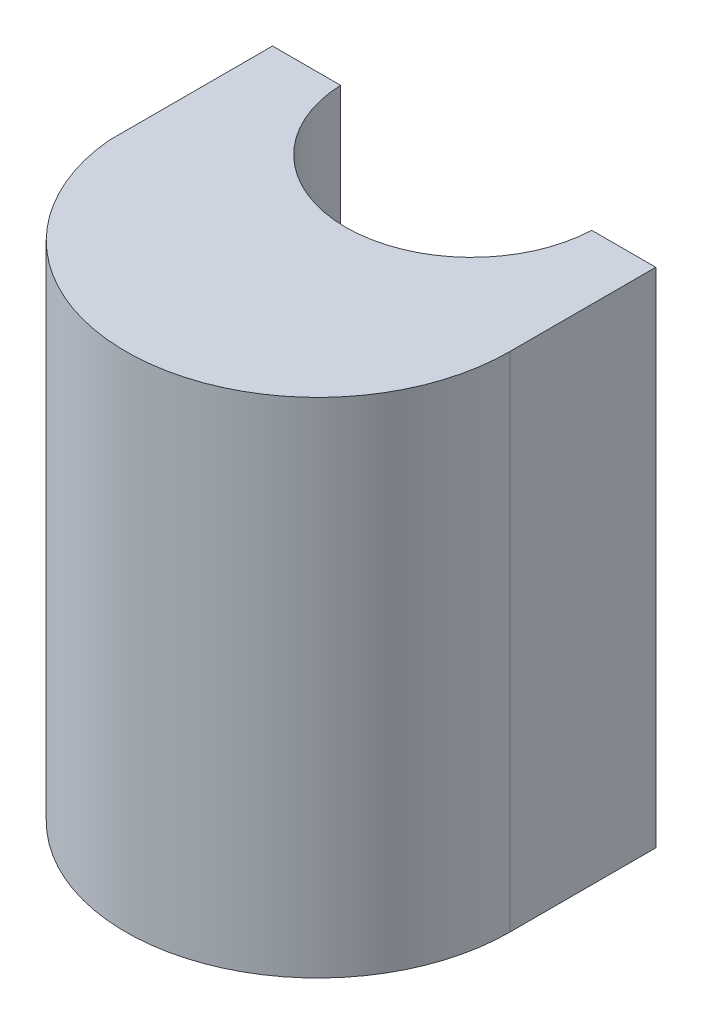
ISO-10303-21;
HEADER;
FILE_DESCRIPTION(('STEP AP214'),'2;1');
FILE_NAME('part.step','',(''),(''),'','','');
FILE_SCHEMA(('AUTOMOTIVE_DESIGN { 1 0 10303 214 1 1 1 1 }'));
ENDSEC;
DATA;
#1=APPLICATION_CONTEXT('core data for automotive mechanical design processes');
#2=APPLICATION_PROTOCOL_DEFINITION('international standard','automotive_design',2000,#1);
#3=PRODUCT_CONTEXT('',#1,'mechanical');
#4=PRODUCT('Part','Part','',(#3));
#5=PRODUCT_RELATED_PRODUCT_CATEGORY('part','',(#4));
#6=PRODUCT_DEFINITION_FORMATION('','',#4);
#7=PRODUCT_DEFINITION_CONTEXT('part definition',#1,'design');
#8=PRODUCT_DEFINITION('design','',#6,#7);
#9=PRODUCT_DEFINITION_SHAPE('','',#8);
#10=(LENGTH_UNIT() NAMED_UNIT(*) SI_UNIT(.MILLI.,.METRE.));
#11=(NAMED_UNIT(*) PLANE_ANGLE_UNIT() SI_UNIT($,.RADIAN.));
#12=(NAMED_UNIT(*) SI_UNIT($,.STERADIAN.) SOLID_ANGLE_UNIT());
#13=UNCERTAINTY_MEASURE_WITH_UNIT(LENGTH_MEASURE(1.E-05),#10,'distance_accuracy_value','');
#14=(GEOMETRIC_REPRESENTATION_CONTEXT(3) GLOBAL_UNCERTAINTY_ASSIGNED_CONTEXT((#13)) GLOBAL_UNIT_ASSIGNED_CONTEXT((#10,
#11,#12)) REPRESENTATION_CONTEXT('',''));
#15=CARTESIAN_POINT('',(0.,0.,0.));
#16=DIRECTION('',(0.,0.,1.));
#17=DIRECTION('',(1.,0.,0.));
#18=AXIS2_PLACEMENT_3D('',#15,#16,#17);
#19=CARTESIAN_POINT('',(1.26536763995208,2.87183105039429,15.5890947887312));
#20=DIRECTION('',(0.,1.,0.));
#21=DIRECTION('',(0.,0.,-1.));
#22=AXIS2_PLACEMENT_3D('',#19,#20,#21);
#23=PLANE('',#22);
#24=DIRECTION('',(2.31603663807447E-12,0.,-1.));
#25=VECTOR('',#24,1.);
#26=CARTESIAN_POINT('',(7.06435869383469,2.87183105039428,7.0923266892118));
#27=LINE('',#26,#25);
#28=CARTESIAN_POINT('',(7.06435869383469,2.87183105039428,7.0923266892118));
#29=VERTEX_POINT('',#28);
#30=CARTESIAN_POINT('',(7.0643586938356,2.87183105039428,6.70112871047515));
#31=VERTEX_POINT('',#30);
#32=EDGE_CURVE('E104',#29,#31,#27,.T.);
#33=ORIENTED_EDGE('',*,*,#32,.F.);
#34=CARTESIAN_POINT('',(7.52065208881852,2.87183105039428,7.04923878887403));
#35=DIRECTION('',(0.,1.,0.));
#36=DIRECTION('',(-0.995571061700838,0.,0.0940120263788917));
#37=AXIS2_PLACEMENT_3D('',#34,#35,#36);
#38=CIRCLE('',#37,0.458323280514298);
#39=CARTESIAN_POINT('',(7.97897536933283,2.87183105039428,7.04923878887417));
#40=VERTEX_POINT('',#39);
#41=EDGE_CURVE('E136',#29,#40,#38,.T.);
#42=ORIENTED_EDGE('',*,*,#41,.T.);
#43=DIRECTION('',(7.39892430869169E-12,0.,1.));
#44=VECTOR('',#43,1.);
#45=CARTESIAN_POINT('',(7.97897536933023,2.87183105039428,6.70112871047536));
#46=LINE('',#45,#44);
#47=CARTESIAN_POINT('',(7.97897536933023,2.87183105039428,6.70112871047536));
#48=VERTEX_POINT('',#47);
#49=EDGE_CURVE('E25',#48,#40,#46,.T.);
#50=ORIENTED_EDGE('',*,*,#49,.F.);
#51=DIRECTION('',(-1.,0.,-5.81579420434685E-13));
#52=VECTOR('',#51,1.);
#53=CARTESIAN_POINT('',(7.97897536933023,2.87183105039428,6.70112871047536));
#54=LINE('',#53,#52);
#55=CARTESIAN_POINT('',(7.82619870273983,2.87183105039428,6.70112871047476));
#56=VERTEX_POINT('',#55);
#57=EDGE_CURVE('E11',#48,#56,#54,.T.);
#58=ORIENTED_EDGE('',*,*,#57,.T.);
#59=CARTESIAN_POINT('',(7.52646763995186,2.87183105039428,6.68842871047528));
#60=DIRECTION('',(0.,1.,0.));
#61=DIRECTION('',(0.,0.,1.));
#62=AXIS2_PLACEMENT_3D('',#59,#60,#61);
#63=CIRCLE('',#62,0.299999999999994);
#64=CARTESIAN_POINT('',(7.2267365771639,2.87183105039428,6.70112871047519));
#65=VERTEX_POINT('',#64);
#66=EDGE_CURVE('E144',#65,#56,#63,.T.);
#67=ORIENTED_EDGE('',*,*,#66,.F.);
#68=DIRECTION('',(-1.,0.,-2.19014998791785E-13));
#69=VECTOR('',#68,1.);
#70=CARTESIAN_POINT('',(7.22673657716388,2.87183105039428,6.70112871047519));
#71=LINE('',#70,#69);
#72=EDGE_CURVE('E69',#65,#31,#71,.T.);
#73=ORIENTED_EDGE('',*,*,#72,.T.);
#74=EDGE_LOOP('',(#33,#42,#50,#58,#67,#73));
#75=FACE_BOUND('',#74,.T.);
#76=ADVANCED_FACE('F17',(#75),#23,.T.);
#77=CARTESIAN_POINT('',(7.82619870273983,2.87183105039428,6.70112871047527));
#78=DIRECTION('',(5.81579420434685E-13,0.,-1.));
#79=DIRECTION('',(0.,-1.,0.));
#80=AXIS2_PLACEMENT_3D('',#77,#78,#79);
#81=PLANE('',#80);
#82=DIRECTION('',(-1.,0.,-5.81579420434685E-13));
#83=VECTOR('',#82,1.);
#84=CARTESIAN_POINT('',(4.54578317134854,1.6718310055699,6.70112871047337));
#85=LINE('',#84,#83);
#86=CARTESIAN_POINT('',(7.97897536933024,1.6718310055699,6.70112871047536));
#87=VERTEX_POINT('',#86);
#88=CARTESIAN_POINT('',(7.82619870273984,1.6718310055699,6.70112871047476));
#89=VERTEX_POINT('',#88);
#90=EDGE_CURVE('E129',#87,#89,#85,.T.);
#91=ORIENTED_EDGE('',*,*,#90,.T.);
#92=DIRECTION('',(0.,-1.,0.));
#93=VECTOR('',#92,1.);
#94=CARTESIAN_POINT('',(7.82619870273983,2.87183105039428,6.70112871047476));
#95=LINE('',#94,#93);
#96=EDGE_CURVE('E106',#56,#89,#95,.T.);
#97=ORIENTED_EDGE('',*,*,#96,.F.);
#98=ORIENTED_EDGE('',*,*,#57,.F.);
#99=DIRECTION('',(0.,-1.,0.));
#100=VECTOR('',#99,1.);
#101=CARTESIAN_POINT('',(7.97897536933023,2.87183105039428,6.70112871047536));
#102=LINE('',#101,#100);
#103=EDGE_CURVE('E133',#48,#87,#102,.T.);
#104=ORIENTED_EDGE('',*,*,#103,.T.);
#105=EDGE_LOOP('',(#91,#97,#98,#104));
#106=FACE_BOUND('',#105,.T.);
#107=ADVANCED_FACE('F219',(#106),#81,.T.);
#108=CARTESIAN_POINT('',(7.97897536933023,2.87183105039428,6.70112871047536));
#109=DIRECTION('',(1.,0.,-7.39892430869169E-12));
#110=DIRECTION('',(-7.39892430869169E-12,0.,-1.));
#111=AXIS2_PLACEMENT_3D('',#108,#109,#110);
#112=PLANE('',#111);
#113=DIRECTION('',(-7.39892430869169E-12,0.,-1.));
#114=VECTOR('',#113,1.);
#115=CARTESIAN_POINT('',(7.97897536936311,1.6718310055699,11.1451117495784));
#116=LINE('',#115,#114);
#117=CARTESIAN_POINT('',(7.97897536933283,1.6718310055699,7.04923878887417));
#118=VERTEX_POINT('',#117);
#119=EDGE_CURVE('E137',#118,#87,#116,.T.);
#120=ORIENTED_EDGE('',*,*,#119,.T.);
#121=ORIENTED_EDGE('',*,*,#103,.F.);
#122=ORIENTED_EDGE('',*,*,#49,.T.);
#123=DIRECTION('',(0.,-1.,0.));
#124=VECTOR('',#123,1.);
#125=CARTESIAN_POINT('',(7.97897536933283,2.87183105039428,7.04923878887417));
#126=LINE('',#125,#124);
#127=EDGE_CURVE('E75',#40,#118,#126,.T.);
#128=ORIENTED_EDGE('',*,*,#127,.T.);
#129=EDGE_LOOP('',(#120,#121,#122,#128));
#130=FACE_BOUND('',#129,.T.);
#131=ADVANCED_FACE('F224',(#130),#112,.T.);
#132=CARTESIAN_POINT('',(7.52065208881852,2.87183105039428,7.04923878887403));
#133=DIRECTION('',(0.,-1.,0.));
#134=DIRECTION('',(-0.995571061700838,0.,0.0940120263788917));
#135=AXIS2_PLACEMENT_3D('',#132,#133,#134);
#136=CYLINDRICAL_SURFACE('',#135,0.458323280514298);
#137=CARTESIAN_POINT('',(7.52065208881852,1.6718310055699,7.04923878887403));
#138=DIRECTION('',(0.,1.,0.));
#139=DIRECTION('',(-0.995571061700838,0.,0.0940120263788917));
#140=AXIS2_PLACEMENT_3D('',#137,#138,#139);
#141=CIRCLE('',#140,0.458323280514298);
#142=CARTESIAN_POINT('',(7.0643586938347,1.6718310055699,7.0923266892118));
#143=VERTEX_POINT('',#142);
#144=EDGE_CURVE('E122',#143,#118,#141,.T.);
#145=ORIENTED_EDGE('',*,*,#144,.T.);
#146=ORIENTED_EDGE('',*,*,#127,.F.);
#147=ORIENTED_EDGE('',*,*,#41,.F.);
#148=DIRECTION('',(0.,-1.,0.));
#149=VECTOR('',#148,1.);
#150=CARTESIAN_POINT('',(7.06435869383469,2.87183105039428,7.0923266892118));
#151=LINE('',#150,#149);
#152=EDGE_CURVE('E145',#29,#143,#151,.T.);
#153=ORIENTED_EDGE('',*,*,#152,.T.);
#154=EDGE_LOOP('',(#145,#146,#147,#153));
#155=FACE_BOUND('',#154,.T.);
#156=ADVANCED_FACE('F223',(#155),#136,.T.);
#157=CARTESIAN_POINT('',(7.06435869383469,2.87183105039428,7.0923266892118));
#158=DIRECTION('',(-1.,0.,-2.31603663807447E-12));
#159=DIRECTION('',(-2.31603663807447E-12,0.,1.));
#160=AXIS2_PLACEMENT_3D('',#157,#158,#159);
#161=PLANE('',#160);
#162=DIRECTION('',(-2.31603663807447E-12,0.,1.));
#163=VECTOR('',#162,1.);
#164=CARTESIAN_POINT('',(7.06435869382485,1.6718310055699,11.3407107389782));
#165=LINE('',#164,#163);
#166=CARTESIAN_POINT('',(7.06435869383561,1.6718310055699,6.70112871047515));
#167=VERTEX_POINT('',#166);
#168=EDGE_CURVE('E102',#167,#143,#165,.T.);
#169=ORIENTED_EDGE('',*,*,#168,.T.);
#170=ORIENTED_EDGE('',*,*,#152,.F.);
#171=ORIENTED_EDGE('',*,*,#32,.T.);
#172=DIRECTION('',(0.,-1.,0.));
#173=VECTOR('',#172,1.);
#174=CARTESIAN_POINT('',(7.0643586938356,2.87183105039428,6.70112871047515));
#175=LINE('',#174,#173);
#176=EDGE_CURVE('E97',#31,#167,#175,.T.);
#177=ORIENTED_EDGE('',*,*,#176,.T.);
#178=EDGE_LOOP('',(#169,#170,#171,#177));
#179=FACE_BOUND('',#178,.T.);
#180=ADVANCED_FACE('F99',(#179),#161,.T.);
#181=CARTESIAN_POINT('',(7.0643586938356,2.87183105039428,6.70112871047515));
#182=DIRECTION('',(2.19014998791785E-13,0.,-1.));
#183=DIRECTION('',(0.,-1.,0.));
#184=AXIS2_PLACEMENT_3D('',#181,#182,#183);
#185=PLANE('',#184);
#186=DIRECTION('',(-1.,0.,-2.19014998791785E-13));
#187=VECTOR('',#186,1.);
#188=CARTESIAN_POINT('',(4.16486316689482,1.6718310055699,6.70112871047452));
#189=LINE('',#188,#187);
#190=CARTESIAN_POINT('',(7.22673657716391,1.6718310055699,6.70112871047519));
#191=VERTEX_POINT('',#190);
#192=EDGE_CURVE('E109',#191,#167,#189,.T.);
#193=ORIENTED_EDGE('',*,*,#192,.T.);
#194=ORIENTED_EDGE('',*,*,#176,.F.);
#195=ORIENTED_EDGE('',*,*,#72,.F.);
#196=DIRECTION('',(0.,-1.,0.));
#197=VECTOR('',#196,1.);
#198=CARTESIAN_POINT('',(7.2267365771639,2.87183105039428,6.70112871047519));
#199=LINE('',#198,#197);
#200=EDGE_CURVE('E112',#65,#191,#199,.T.);
#201=ORIENTED_EDGE('',*,*,#200,.T.);
#202=EDGE_LOOP('',(#193,#194,#195,#201));
#203=FACE_BOUND('',#202,.T.);
#204=ADVANCED_FACE('F110',(#203),#185,.T.);
#205=CARTESIAN_POINT('',(7.52646763995186,2.87183105039428,6.68842871047528));
#206=DIRECTION('',(0.,-1.,0.));
#207=DIRECTION('',(0.,0.,1.));
#208=AXIS2_PLACEMENT_3D('',#205,#206,#207);
#209=CYLINDRICAL_SURFACE('',#208,0.299999999999994);
#210=CARTESIAN_POINT('',(7.52646763995186,1.6718310055699,6.68842871047528));
#211=DIRECTION('',(0.,-1.,0.));
#212=DIRECTION('',(0.,0.,1.));
#213=AXIS2_PLACEMENT_3D('',#210,#211,#212);
#214=CIRCLE('',#213,0.299999999999994);
#215=EDGE_CURVE('E117',#89,#191,#214,.T.);
#216=ORIENTED_EDGE('',*,*,#215,.T.);
#217=ORIENTED_EDGE('',*,*,#200,.F.);
#218=ORIENTED_EDGE('',*,*,#66,.T.);
#219=ORIENTED_EDGE('',*,*,#96,.T.);
#220=EDGE_LOOP('',(#216,#217,#218,#219));
#221=FACE_BOUND('',#220,.T.);
#222=ADVANCED_FACE('F221',(#221),#209,.F.);
#223=CARTESIAN_POINT('',(1.26536763995209,1.6718310055699,15.5890947887312));
#224=DIRECTION('',(0.,1.,0.));
#225=DIRECTION('',(0.,0.,-1.));
#226=AXIS2_PLACEMENT_3D('',#223,#224,#225);
#227=PLANE('',#226);
#228=ORIENTED_EDGE('',*,*,#168,.F.);
#229=ORIENTED_EDGE('',*,*,#192,.F.);
#230=ORIENTED_EDGE('',*,*,#215,.F.);
#231=ORIENTED_EDGE('',*,*,#90,.F.);
#232=ORIENTED_EDGE('',*,*,#119,.F.);
#233=ORIENTED_EDGE('',*,*,#144,.F.);
#234=EDGE_LOOP('',(#228,#229,#230,#231,#232,#233));
#235=FACE_BOUND('',#234,.T.);
#236=ADVANCED_FACE('F120',(#235),#227,.F.);
#237=CLOSED_SHELL('',(#76,#107,#131,#156,#180,#204,#222,#236));
#238=MANIFOLD_SOLID_BREP('B1',#237);
#239=ADVANCED_BREP_SHAPE_REPRESENTATION('',(#18,#238),#14);
#240=SHAPE_DEFINITION_REPRESENTATION(#9,#239);
ENDSEC;
END-ISO-10303-21;
